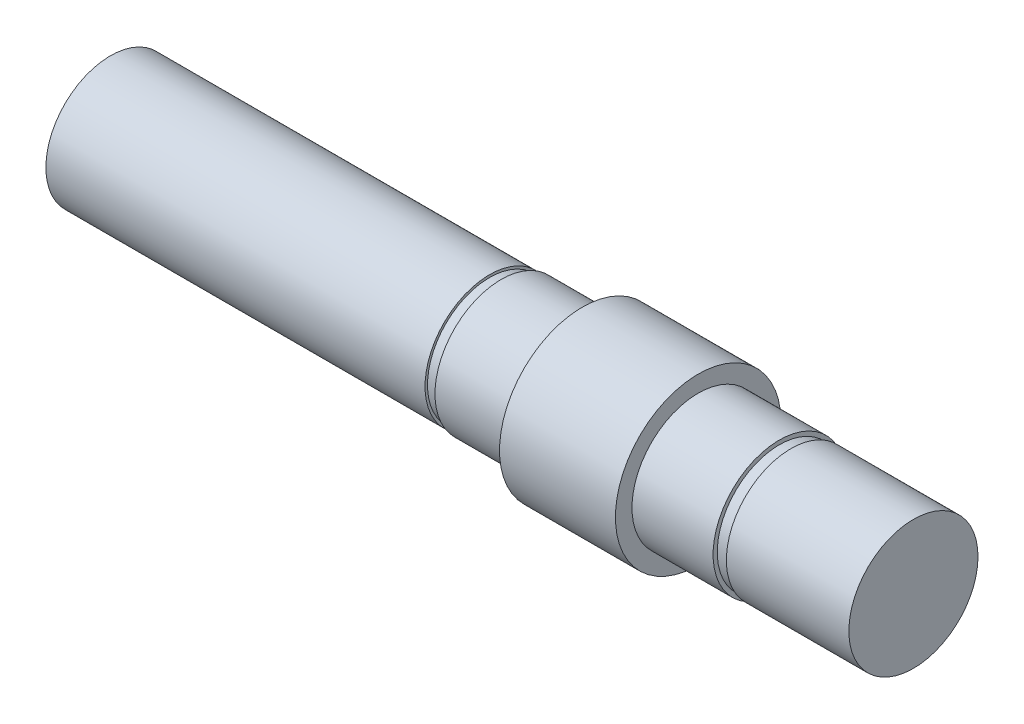
ISO-10303-21;
HEADER;
FILE_DESCRIPTION(('STEP AP214'),'2;1');
FILE_NAME('part.step','',(''),(''),'','','');
FILE_SCHEMA(('AUTOMOTIVE_DESIGN { 1 0 10303 214 1 1 1 1 }'));
ENDSEC;
DATA;
#1=APPLICATION_CONTEXT('core data for automotive mechanical design processes');
#2=APPLICATION_PROTOCOL_DEFINITION('international standard','automotive_design',2000,#1);
#3=PRODUCT_CONTEXT('',#1,'mechanical');
#4=PRODUCT('Part','Part','',(#3));
#5=PRODUCT_RELATED_PRODUCT_CATEGORY('part','',(#4));
#6=PRODUCT_DEFINITION_FORMATION('','',#4);
#7=PRODUCT_DEFINITION_CONTEXT('part definition',#1,'design');
#8=PRODUCT_DEFINITION('design','',#6,#7);
#9=PRODUCT_DEFINITION_SHAPE('','',#8);
#10=(LENGTH_UNIT() NAMED_UNIT(*) SI_UNIT(.MILLI.,.METRE.));
#11=(NAMED_UNIT(*) PLANE_ANGLE_UNIT() SI_UNIT($,.RADIAN.));
#12=(NAMED_UNIT(*) SI_UNIT($,.STERADIAN.) SOLID_ANGLE_UNIT());
#13=UNCERTAINTY_MEASURE_WITH_UNIT(LENGTH_MEASURE(1.E-05),#10,'distance_accuracy_value','');
#14=(GEOMETRIC_REPRESENTATION_CONTEXT(3) GLOBAL_UNCERTAINTY_ASSIGNED_CONTEXT((#13)) GLOBAL_UNIT_ASSIGNED_CONTEXT((#10,
#11,#12)) REPRESENTATION_CONTEXT('',''));
#15=CARTESIAN_POINT('',(0.,0.,0.));
#16=DIRECTION('',(0.,0.,1.));
#17=DIRECTION('',(1.,0.,0.));
#18=AXIS2_PLACEMENT_3D('',#15,#16,#17);
#19=CARTESIAN_POINT('',(128.,-116.2,0.));
#20=DIRECTION('',(-1.,0.,0.));
#21=DIRECTION('',(0.,0.,1.));
#22=AXIS2_PLACEMENT_3D('',#19,#20,#21);
#23=PLANE('',#22);
#24=CARTESIAN_POINT('',(128.,-121.2,0.));
#25=DIRECTION('',(1.,0.,0.));
#26=DIRECTION('',(0.,0.,-1.));
#27=AXIS2_PLACEMENT_3D('',#24,#25,#26);
#28=CIRCLE('',#27,4.);
#29=CARTESIAN_POINT('',(128.,-121.2,-4.));
#30=VERTEX_POINT('',#29);
#31=EDGE_CURVE('E85',#30,#30,#28,.T.);
#32=ORIENTED_EDGE('',*,*,#31,.T.);
#33=EDGE_LOOP('',(#32));
#34=FACE_BOUND('',#33,.T.);
#35=CARTESIAN_POINT('',(128.,-121.2,0.));
#36=DIRECTION('',(1.,0.,0.));
#37=DIRECTION('',(0.,0.,-1.));
#38=AXIS2_PLACEMENT_3D('',#35,#36,#37);
#39=CIRCLE('',#38,5.);
#40=CARTESIAN_POINT('',(128.,-121.2,-5.));
#41=VERTEX_POINT('',#40);
#42=EDGE_CURVE('E10',#41,#41,#39,.T.);
#43=ORIENTED_EDGE('',*,*,#42,.F.);
#44=EDGE_LOOP('',(#43));
#45=FACE_BOUND('',#44,.T.);
#46=ADVANCED_FACE('F39',(#34,#45),#23,.T.);
#47=CARTESIAN_POINT('',(148.,-121.2,0.));
#48=DIRECTION('',(1.,0.,0.));
#49=DIRECTION('',(0.,0.,-1.));
#50=AXIS2_PLACEMENT_3D('',#47,#48,#49);
#51=CYLINDRICAL_SURFACE('',#50,5.);
#52=ORIENTED_EDGE('',*,*,#42,.T.);
#53=EDGE_LOOP('',(#52));
#54=FACE_BOUND('',#53,.T.);
#55=CARTESIAN_POINT('',(135.,-121.2,0.));
#56=DIRECTION('',(1.,0.,0.));
#57=DIRECTION('',(0.,0.,-1.));
#58=AXIS2_PLACEMENT_3D('',#55,#56,#57);
#59=CIRCLE('',#58,5.);
#60=CARTESIAN_POINT('',(135.,-121.2,-5.));
#61=VERTEX_POINT('',#60);
#62=EDGE_CURVE('E45',#61,#61,#59,.T.);
#63=ORIENTED_EDGE('',*,*,#62,.F.);
#64=EDGE_LOOP('',(#63));
#65=FACE_BOUND('',#64,.T.);
#66=ADVANCED_FACE('F103',(#54,#65),#51,.T.);
#67=CARTESIAN_POINT('',(135.,-116.2,0.));
#68=DIRECTION('',(-1.,0.,0.));
#69=DIRECTION('',(0.,0.,1.));
#70=AXIS2_PLACEMENT_3D('',#67,#68,#69);
#71=PLANE('',#70);
#72=CARTESIAN_POINT('',(135.,-121.2,0.));
#73=DIRECTION('',(1.,0.,0.));
#74=DIRECTION('',(0.,0.,-1.));
#75=AXIS2_PLACEMENT_3D('',#72,#73,#74);
#76=CIRCLE('',#75,4.);
#77=CARTESIAN_POINT('',(135.,-121.2,-4.));
#78=VERTEX_POINT('',#77);
#79=EDGE_CURVE('E49',#78,#78,#76,.T.);
#80=ORIENTED_EDGE('',*,*,#79,.F.);
#81=EDGE_LOOP('',(#80));
#82=FACE_BOUND('',#81,.T.);
#83=ORIENTED_EDGE('',*,*,#62,.T.);
#84=EDGE_LOOP('',(#83));
#85=FACE_BOUND('',#84,.T.);
#86=ADVANCED_FACE('F107',(#82,#85),#71,.F.);
#87=CARTESIAN_POINT('',(148.,-121.2,0.));
#88=DIRECTION('',(1.,0.,0.));
#89=DIRECTION('',(0.,0.,-1.));
#90=AXIS2_PLACEMENT_3D('',#87,#88,#89);
#91=CYLINDRICAL_SURFACE('',#90,4.);
#92=CARTESIAN_POINT('',(139.9,-121.2,0.));
#93=DIRECTION('',(1.,0.,0.));
#94=DIRECTION('',(0.,0.,-1.));
#95=AXIS2_PLACEMENT_3D('',#92,#93,#94);
#96=CIRCLE('',#95,4.);
#97=CARTESIAN_POINT('',(139.9,-121.2,-4.));
#98=VERTEX_POINT('',#97);
#99=EDGE_CURVE('E53',#98,#98,#96,.T.);
#100=ORIENTED_EDGE('',*,*,#99,.F.);
#101=EDGE_LOOP('',(#100));
#102=FACE_BOUND('',#101,.T.);
#103=ORIENTED_EDGE('',*,*,#79,.T.);
#104=EDGE_LOOP('',(#103));
#105=FACE_BOUND('',#104,.T.);
#106=ADVANCED_FACE('F111',(#102,#105),#91,.T.);
#107=CARTESIAN_POINT('',(139.9,-117.2,0.));
#108=DIRECTION('',(-1.,0.,0.));
#109=DIRECTION('',(0.,0.,1.));
#110=AXIS2_PLACEMENT_3D('',#107,#108,#109);
#111=PLANE('',#110);
#112=CARTESIAN_POINT('',(139.9,-121.2,0.));
#113=DIRECTION('',(1.,0.,0.));
#114=DIRECTION('',(0.,0.,-1.));
#115=AXIS2_PLACEMENT_3D('',#112,#113,#114);
#116=CIRCLE('',#115,3.75);
#117=CARTESIAN_POINT('',(139.9,-121.2,-3.75));
#118=VERTEX_POINT('',#117);
#119=EDGE_CURVE('E58',#118,#118,#116,.T.);
#120=ORIENTED_EDGE('',*,*,#119,.F.);
#121=EDGE_LOOP('',(#120));
#122=FACE_BOUND('',#121,.T.);
#123=ORIENTED_EDGE('',*,*,#99,.T.);
#124=EDGE_LOOP('',(#123));
#125=FACE_BOUND('',#124,.T.);
#126=ADVANCED_FACE('F118',(#122,#125),#111,.F.);
#127=CARTESIAN_POINT('',(148.,-121.2,0.));
#128=DIRECTION('',(1.,0.,0.));
#129=DIRECTION('',(0.,0.,-1.));
#130=AXIS2_PLACEMENT_3D('',#127,#128,#129);
#131=CYLINDRICAL_SURFACE('',#130,3.75);
#132=CARTESIAN_POINT('',(140.6,-121.2,0.));
#133=DIRECTION('',(1.,0.,0.));
#134=DIRECTION('',(0.,0.,-1.));
#135=AXIS2_PLACEMENT_3D('',#132,#133,#134);
#136=CIRCLE('',#135,3.75);
#137=CARTESIAN_POINT('',(140.6,-121.2,-3.75));
#138=VERTEX_POINT('',#137);
#139=EDGE_CURVE('E61',#138,#138,#136,.T.);
#140=ORIENTED_EDGE('',*,*,#139,.F.);
#141=EDGE_LOOP('',(#140));
#142=FACE_BOUND('',#141,.T.);
#143=ORIENTED_EDGE('',*,*,#119,.T.);
#144=EDGE_LOOP('',(#143));
#145=FACE_BOUND('',#144,.T.);
#146=ADVANCED_FACE('F122',(#142,#145),#131,.T.);
#147=CARTESIAN_POINT('',(140.6,-117.45,0.));
#148=DIRECTION('',(1.,0.,0.));
#149=DIRECTION('',(0.,0.,-1.));
#150=AXIS2_PLACEMENT_3D('',#147,#148,#149);
#151=PLANE('',#150);
#152=CARTESIAN_POINT('',(140.6,-121.2,0.));
#153=DIRECTION('',(1.,0.,0.));
#154=DIRECTION('',(0.,0.,-1.));
#155=AXIS2_PLACEMENT_3D('',#152,#153,#154);
#156=CIRCLE('',#155,3.9);
#157=CARTESIAN_POINT('',(140.6,-121.2,-3.9));
#158=VERTEX_POINT('',#157);
#159=EDGE_CURVE('E64',#158,#158,#156,.T.);
#160=ORIENTED_EDGE('',*,*,#159,.F.);
#161=EDGE_LOOP('',(#160));
#162=FACE_BOUND('',#161,.T.);
#163=ORIENTED_EDGE('',*,*,#139,.T.);
#164=EDGE_LOOP('',(#163));
#165=FACE_BOUND('',#164,.T.);
#166=ADVANCED_FACE('F126',(#162,#165),#151,.F.);
#167=CARTESIAN_POINT('',(148.,-121.2,0.));
#168=DIRECTION('',(1.,0.,0.));
#169=DIRECTION('',(0.,0.,-1.));
#170=AXIS2_PLACEMENT_3D('',#167,#168,#169);
#171=CYLINDRICAL_SURFACE('',#170,3.9);
#172=CARTESIAN_POINT('',(148.,-121.2,0.));
#173=DIRECTION('',(1.,0.,0.));
#174=DIRECTION('',(0.,0.,-1.));
#175=AXIS2_PLACEMENT_3D('',#172,#173,#174);
#176=CIRCLE('',#175,3.9);
#177=CARTESIAN_POINT('',(148.,-121.2,-3.9));
#178=VERTEX_POINT('',#177);
#179=EDGE_CURVE('E67',#178,#178,#176,.T.);
#180=ORIENTED_EDGE('',*,*,#179,.F.);
#181=EDGE_LOOP('',(#180));
#182=FACE_BOUND('',#181,.T.);
#183=ORIENTED_EDGE('',*,*,#159,.T.);
#184=EDGE_LOOP('',(#183));
#185=FACE_BOUND('',#184,.T.);
#186=ADVANCED_FACE('F130',(#182,#185),#171,.T.);
#187=CARTESIAN_POINT('',(148.,-117.3,0.));
#188=DIRECTION('',(-1.,0.,0.));
#189=DIRECTION('',(0.,0.,1.));
#190=AXIS2_PLACEMENT_3D('',#187,#188,#189);
#191=PLANE('',#190);
#192=ORIENTED_EDGE('',*,*,#179,.T.);
#193=EDGE_LOOP('',(#192));
#194=FACE_BOUND('',#193,.T.);
#195=ADVANCED_FACE('F134',(#194),#191,.F.);
#196=CARTESIAN_POINT('',(99.5,-117.3,0.));
#197=DIRECTION('',(-1.,0.,0.));
#198=DIRECTION('',(0.,0.,1.));
#199=AXIS2_PLACEMENT_3D('',#196,#197,#198);
#200=PLANE('',#199);
#201=CARTESIAN_POINT('',(99.5,-121.2,0.));
#202=DIRECTION('',(1.,0.,0.));
#203=DIRECTION('',(0.,0.,-1.));
#204=AXIS2_PLACEMENT_3D('',#201,#202,#203);
#205=CIRCLE('',#204,3.9);
#206=CARTESIAN_POINT('',(99.5,-121.2,-3.9));
#207=VERTEX_POINT('',#206);
#208=EDGE_CURVE('E70',#207,#207,#205,.T.);
#209=ORIENTED_EDGE('',*,*,#208,.F.);
#210=EDGE_LOOP('',(#209));
#211=FACE_BOUND('',#210,.T.);
#212=ADVANCED_FACE('F138',(#211),#200,.T.);
#213=CARTESIAN_POINT('',(148.,-121.2,0.));
#214=DIRECTION('',(1.,0.,0.));
#215=DIRECTION('',(0.,0.,-1.));
#216=AXIS2_PLACEMENT_3D('',#213,#214,#215);
#217=CYLINDRICAL_SURFACE('',#216,3.9);
#218=ORIENTED_EDGE('',*,*,#208,.T.);
#219=EDGE_LOOP('',(#218));
#220=FACE_BOUND('',#219,.T.);
#221=CARTESIAN_POINT('',(122.4,-121.2,0.));
#222=DIRECTION('',(1.,0.,0.));
#223=DIRECTION('',(0.,0.,-1.));
#224=AXIS2_PLACEMENT_3D('',#221,#222,#223);
#225=CIRCLE('',#224,3.9);
#226=CARTESIAN_POINT('',(122.4,-121.2,-3.9));
#227=VERTEX_POINT('',#226);
#228=EDGE_CURVE('E73',#227,#227,#225,.T.);
#229=ORIENTED_EDGE('',*,*,#228,.F.);
#230=EDGE_LOOP('',(#229));
#231=FACE_BOUND('',#230,.T.);
#232=ADVANCED_FACE('F142',(#220,#231),#217,.T.);
#233=CARTESIAN_POINT('',(122.4,-117.45,0.));
#234=DIRECTION('',(1.,0.,0.));
#235=DIRECTION('',(0.,0.,-1.));
#236=AXIS2_PLACEMENT_3D('',#233,#234,#235);
#237=PLANE('',#236);
#238=ORIENTED_EDGE('',*,*,#228,.T.);
#239=EDGE_LOOP('',(#238));
#240=FACE_BOUND('',#239,.T.);
#241=CARTESIAN_POINT('',(122.4,-121.2,0.));
#242=DIRECTION('',(1.,0.,0.));
#243=DIRECTION('',(0.,0.,-1.));
#244=AXIS2_PLACEMENT_3D('',#241,#242,#243);
#245=CIRCLE('',#244,3.75);
#246=CARTESIAN_POINT('',(122.4,-121.2,-3.75));
#247=VERTEX_POINT('',#246);
#248=EDGE_CURVE('E76',#247,#247,#245,.T.);
#249=ORIENTED_EDGE('',*,*,#248,.F.);
#250=EDGE_LOOP('',(#249));
#251=FACE_BOUND('',#250,.T.);
#252=ADVANCED_FACE('F146',(#240,#251),#237,.T.);
#253=CARTESIAN_POINT('',(148.,-121.2,0.));
#254=DIRECTION('',(1.,0.,0.));
#255=DIRECTION('',(0.,0.,-1.));
#256=AXIS2_PLACEMENT_3D('',#253,#254,#255);
#257=CYLINDRICAL_SURFACE('',#256,3.75);
#258=ORIENTED_EDGE('',*,*,#248,.T.);
#259=EDGE_LOOP('',(#258));
#260=FACE_BOUND('',#259,.T.);
#261=CARTESIAN_POINT('',(123.1,-121.2,0.));
#262=DIRECTION('',(1.,0.,0.));
#263=DIRECTION('',(0.,0.,-1.));
#264=AXIS2_PLACEMENT_3D('',#261,#262,#263);
#265=CIRCLE('',#264,3.75);
#266=CARTESIAN_POINT('',(123.1,-121.2,-3.75));
#267=VERTEX_POINT('',#266);
#268=EDGE_CURVE('E79',#267,#267,#265,.T.);
#269=ORIENTED_EDGE('',*,*,#268,.F.);
#270=EDGE_LOOP('',(#269));
#271=FACE_BOUND('',#270,.T.);
#272=ADVANCED_FACE('F99',(#260,#271),#257,.T.);
#273=CARTESIAN_POINT('',(123.1,-117.2,0.));
#274=DIRECTION('',(-1.,0.,0.));
#275=DIRECTION('',(0.,0.,1.));
#276=AXIS2_PLACEMENT_3D('',#273,#274,#275);
#277=PLANE('',#276);
#278=ORIENTED_EDGE('',*,*,#268,.T.);
#279=EDGE_LOOP('',(#278));
#280=FACE_BOUND('',#279,.T.);
#281=CARTESIAN_POINT('',(123.1,-121.2,0.));
#282=DIRECTION('',(1.,0.,0.));
#283=DIRECTION('',(0.,0.,-1.));
#284=AXIS2_PLACEMENT_3D('',#281,#282,#283);
#285=CIRCLE('',#284,4.);
#286=CARTESIAN_POINT('',(123.1,-121.2,-4.));
#287=VERTEX_POINT('',#286);
#288=EDGE_CURVE('E82',#287,#287,#285,.T.);
#289=ORIENTED_EDGE('',*,*,#288,.F.);
#290=EDGE_LOOP('',(#289));
#291=FACE_BOUND('',#290,.T.);
#292=ADVANCED_FACE('F93',(#280,#291),#277,.T.);
#293=CARTESIAN_POINT('',(148.,-121.2,0.));
#294=DIRECTION('',(1.,0.,0.));
#295=DIRECTION('',(0.,0.,-1.));
#296=AXIS2_PLACEMENT_3D('',#293,#294,#295);
#297=CYLINDRICAL_SURFACE('',#296,4.);
#298=ORIENTED_EDGE('',*,*,#288,.T.);
#299=EDGE_LOOP('',(#298));
#300=FACE_BOUND('',#299,.T.);
#301=ORIENTED_EDGE('',*,*,#31,.F.);
#302=EDGE_LOOP('',(#301));
#303=FACE_BOUND('',#302,.T.);
#304=ADVANCED_FACE('F91',(#300,#303),#297,.T.);
#305=CLOSED_SHELL('',(#46,#66,#86,#106,#126,#146,#166,#186,#195,#212,#232,#252,#272,#292,#304));
#306=MANIFOLD_SOLID_BREP('B2',#305);
#307=ADVANCED_BREP_SHAPE_REPRESENTATION('',(#18,#306),#14);
#308=SHAPE_DEFINITION_REPRESENTATION(#9,#307);
ENDSEC;
END-ISO-10303-21;
